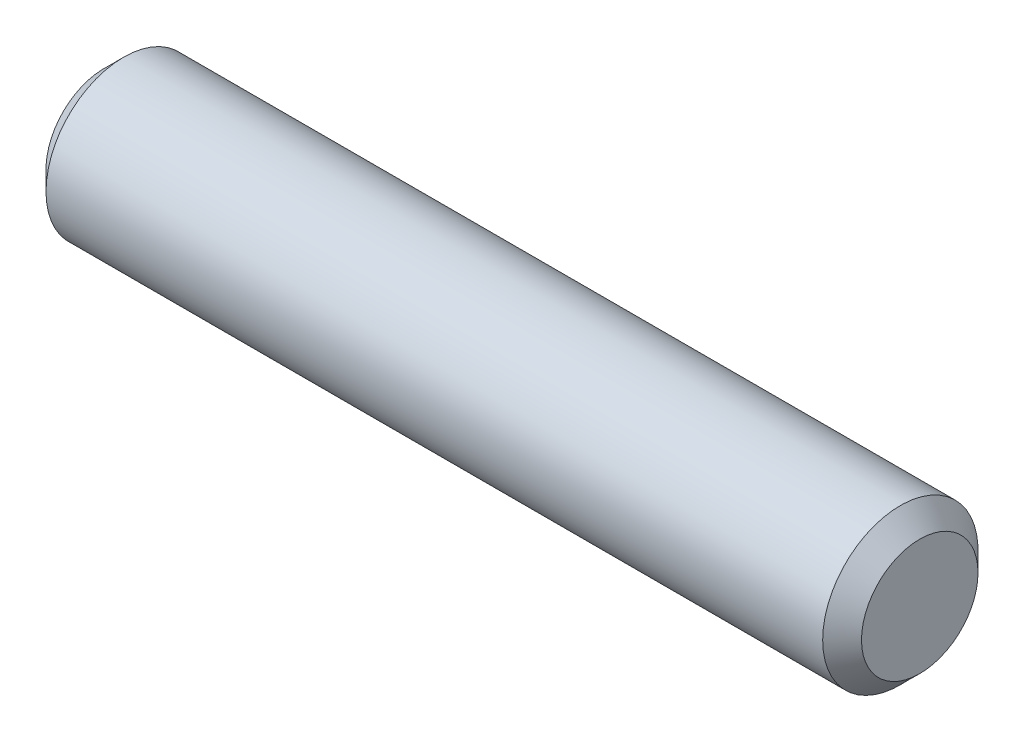
ISO-10303-21;
HEADER;
FILE_DESCRIPTION(('STEP AP214'),'2;1');
FILE_NAME('part.step','',(''),(''),'','','');
FILE_SCHEMA(('AUTOMOTIVE_DESIGN { 1 0 10303 214 1 1 1 1 }'));
ENDSEC;
DATA;
#1=APPLICATION_CONTEXT('core data for automotive mechanical design processes');
#2=APPLICATION_PROTOCOL_DEFINITION('international standard','automotive_design',2000,#1);
#3=PRODUCT_CONTEXT('',#1,'mechanical');
#4=PRODUCT('Part','Part','',(#3));
#5=PRODUCT_RELATED_PRODUCT_CATEGORY('part','',(#4));
#6=PRODUCT_DEFINITION_FORMATION('','',#4);
#7=PRODUCT_DEFINITION_CONTEXT('part definition',#1,'design');
#8=PRODUCT_DEFINITION('design','',#6,#7);
#9=PRODUCT_DEFINITION_SHAPE('','',#8);
#10=(LENGTH_UNIT() NAMED_UNIT(*) SI_UNIT(.MILLI.,.METRE.));
#11=(NAMED_UNIT(*) PLANE_ANGLE_UNIT() SI_UNIT($,.RADIAN.));
#12=(NAMED_UNIT(*) SI_UNIT($,.STERADIAN.) SOLID_ANGLE_UNIT());
#13=UNCERTAINTY_MEASURE_WITH_UNIT(LENGTH_MEASURE(1.E-05),#10,'distance_accuracy_value','');
#14=(GEOMETRIC_REPRESENTATION_CONTEXT(3) GLOBAL_UNCERTAINTY_ASSIGNED_CONTEXT((#13)) GLOBAL_UNIT_ASSIGNED_CONTEXT((#10,
#11,#12)) REPRESENTATION_CONTEXT('',''));
#15=CARTESIAN_POINT('',(0.,0.,0.));
#16=DIRECTION('',(0.,0.,1.));
#17=DIRECTION('',(1.,0.,0.));
#18=AXIS2_PLACEMENT_3D('',#15,#16,#17);
#19=CARTESIAN_POINT('',(10.5,0.,0.));
#20=DIRECTION('',(-1.,0.,0.));
#21=DIRECTION('',(0.,0.,1.));
#22=AXIS2_PLACEMENT_3D('',#19,#20,#21);
#23=CYLINDRICAL_SURFACE('',#22,2.);
#24=CARTESIAN_POINT('',(10.,0.,0.));
#25=DIRECTION('',(1.,0.,0.));
#26=DIRECTION('',(0.,0.,-1.));
#27=AXIS2_PLACEMENT_3D('',#24,#25,#26);
#28=CIRCLE('',#27,2.);
#29=CARTESIAN_POINT('',(10.,0.,2.));
#30=VERTEX_POINT('',#29);
#31=EDGE_CURVE('E54',#30,#30,#28,.F.);
#32=CARTESIAN_POINT('',(-9.99999999999999,0.,0.));
#33=DIRECTION('',(1.,0.,0.));
#34=DIRECTION('',(0.,0.,-1.));
#35=AXIS2_PLACEMENT_3D('',#32,#33,#34);
#36=CIRCLE('',#35,2.);
#37=CARTESIAN_POINT('',(-9.99999999999999,0.,2.));
#38=VERTEX_POINT('',#37);
#39=EDGE_CURVE('E59',#38,#38,#36,.T.);
#40=CARTESIAN_POINT('',(10.,0.,2.));
#41=CARTESIAN_POINT('',(9.79166666666668,0.,2.));
#42=CARTESIAN_POINT('',(9.58333333333334,0.,2.));
#43=CARTESIAN_POINT('',(9.16666666666668,0.,2.));
#44=CARTESIAN_POINT('',(8.95833333333334,0.,2.));
#45=CARTESIAN_POINT('',(8.54166666666668,0.,2.));
#46=CARTESIAN_POINT('',(8.33333333333334,0.,2.));
#47=CARTESIAN_POINT('',(7.91666666666668,0.,2.));
#48=CARTESIAN_POINT('',(7.70833333333334,0.,2.));
#49=CARTESIAN_POINT('',(7.29166666666668,0.,2.));
#50=CARTESIAN_POINT('',(7.08333333333334,0.,2.));
#51=CARTESIAN_POINT('',(6.66666666666668,0.,2.));
#52=CARTESIAN_POINT('',(6.45833333333334,0.,2.));
#53=CARTESIAN_POINT('',(6.04166666666668,0.,2.));
#54=CARTESIAN_POINT('',(5.83333333333334,0.,2.));
#55=CARTESIAN_POINT('',(5.41666666666668,0.,2.));
#56=CARTESIAN_POINT('',(5.20833333333334,0.,2.));
#57=CARTESIAN_POINT('',(4.79166666666668,0.,2.));
#58=CARTESIAN_POINT('',(4.58333333333334,0.,2.));
#59=CARTESIAN_POINT('',(4.16666666666668,0.,2.));
#60=CARTESIAN_POINT('',(3.95833333333334,0.,2.));
#61=CARTESIAN_POINT('',(3.54166666666668,0.,2.));
#62=CARTESIAN_POINT('',(3.33333333333334,0.,2.));
#63=CARTESIAN_POINT('',(2.91666666666668,0.,2.));
#64=CARTESIAN_POINT('',(2.70833333333334,0.,2.));
#65=CARTESIAN_POINT('',(2.29166666666668,0.,2.));
#66=CARTESIAN_POINT('',(2.08333333333334,0.,2.));
#67=CARTESIAN_POINT('',(1.66666666666668,0.,2.));
#68=CARTESIAN_POINT('',(1.45833333333334,0.,2.));
#69=CARTESIAN_POINT('',(1.04166666666668,0.,2.));
#70=CARTESIAN_POINT('',(0.833333333333343,0.,2.));
#71=CARTESIAN_POINT('',(0.416666666666676,0.,2.));
#72=CARTESIAN_POINT('',(0.208333333333342,0.,2.));
#73=CARTESIAN_POINT('',(-0.208333333333325,0.,2.));
#74=CARTESIAN_POINT('',(-0.416666666666658,0.,2.));
#75=CARTESIAN_POINT('',(-0.833333333333325,0.,2.));
#76=CARTESIAN_POINT('',(-1.04166666666666,0.,2.));
#77=CARTESIAN_POINT('',(-1.45833333333333,0.,2.));
#78=CARTESIAN_POINT('',(-1.66666666666666,0.,2.));
#79=CARTESIAN_POINT('',(-2.08333333333332,0.,2.));
#80=CARTESIAN_POINT('',(-2.29166666666666,0.,2.));
#81=CARTESIAN_POINT('',(-2.70833333333333,0.,2.));
#82=CARTESIAN_POINT('',(-2.91666666666666,0.,2.));
#83=CARTESIAN_POINT('',(-3.33333333333333,0.,2.));
#84=CARTESIAN_POINT('',(-3.54166666666666,0.,2.));
#85=CARTESIAN_POINT('',(-3.95833333333333,0.,2.));
#86=CARTESIAN_POINT('',(-4.16666666666666,0.,2.));
#87=CARTESIAN_POINT('',(-4.58333333333333,0.,2.));
#88=CARTESIAN_POINT('',(-4.79166666666666,0.,2.));
#89=CARTESIAN_POINT('',(-5.20833333333333,0.,2.));
#90=CARTESIAN_POINT('',(-5.41666666666666,0.,2.));
#91=CARTESIAN_POINT('',(-5.83333333333333,0.,2.));
#92=CARTESIAN_POINT('',(-6.04166666666666,0.,2.));
#93=CARTESIAN_POINT('',(-6.45833333333333,0.,2.));
#94=CARTESIAN_POINT('',(-6.66666666666666,0.,2.));
#95=CARTESIAN_POINT('',(-7.08333333333332,0.,2.));
#96=CARTESIAN_POINT('',(-7.29166666666666,0.,2.));
#97=CARTESIAN_POINT('',(-7.70833333333333,0.,2.));
#98=CARTESIAN_POINT('',(-7.91666666666666,0.,2.));
#99=CARTESIAN_POINT('',(-8.33333333333333,0.,2.));
#100=CARTESIAN_POINT('',(-8.54166666666666,0.,2.));
#101=CARTESIAN_POINT('',(-8.95833333333333,0.,2.));
#102=CARTESIAN_POINT('',(-9.16666666666666,0.,2.));
#103=CARTESIAN_POINT('',(-9.58333333333333,0.,2.));
#104=CARTESIAN_POINT('',(-9.79166666666666,0.,2.));
#105=CARTESIAN_POINT('',(-9.99999999999999,0.,2.));
#106=B_SPLINE_CURVE_WITH_KNOTS('',3,(#40,#41,#42,#43,#44,#45,#46,#47,#48,#49,#50,#51,#52,#53,
#54,#55,#56,#57,#58,#59,#60,#61,#62,#63,#64,#65,#66,#67,#68,#69,#70,#71,#72,#73,#74,#75,#76,#77,
#78,#79,#80,#81,#82,#83,#84,#85,#86,#87,#88,#89,#90,#91,#92,#93,#94,#95,#96,#97,#98,#99,#100,
#101,#102,#103,#104,#105),.UNSPECIFIED.,.F.,.F.,(4,2,2,2,2,2,2,2,2,2,2,2,2,2,2,2,2,2,2,2,2,2,2,
2,2,2,2,2,2,2,2,2,4),(0.,0.624999999999999,1.25,1.875,2.5,3.125,3.75,4.375,5.,5.625,6.25,6.875,
7.5,8.125,8.75,9.375,10.,10.625,11.25,11.875,12.5,13.125,13.75,14.375,15.,15.625,16.25,16.875,
17.5,18.125,18.75,19.375,20.),.UNSPECIFIED.);
#107=EDGE_CURVE('BSEAM45',#30,#38,#106,.T.);
#108=ORIENTED_EDGE('',*,*,#31,.T.);
#109=ORIENTED_EDGE('',*,*,#39,.T.);
#110=ORIENTED_EDGE('',*,*,#107,.T.);
#111=ORIENTED_EDGE('',*,*,#107,.F.);
#112=EDGE_LOOP('',(#108,#110,#109,#111));
#113=FACE_BOUND('',#112,.T.);
#114=ADVANCED_FACE('F45',(#113),#23,.T.);
#115=CARTESIAN_POINT('',(10.5,0.,0.));
#116=DIRECTION('',(1.,0.,0.));
#117=DIRECTION('',(0.,0.,-1.));
#118=AXIS2_PLACEMENT_3D('',#115,#116,#117);
#119=PLANE('',#118);
#120=CARTESIAN_POINT('',(10.5,0.,0.));
#121=DIRECTION('',(1.,0.,0.));
#122=DIRECTION('',(0.,0.,-1.));
#123=AXIS2_PLACEMENT_3D('',#120,#121,#122);
#124=CIRCLE('',#123,1.50000000000001);
#125=CARTESIAN_POINT('',(10.5,0.,-1.50000000000001));
#126=VERTEX_POINT('',#125);
#127=EDGE_CURVE('E64',#126,#126,#124,.T.);
#128=ORIENTED_EDGE('',*,*,#127,.T.);
#129=EDGE_LOOP('',(#128));
#130=FACE_BOUND('',#129,.T.);
#131=ADVANCED_FACE('F71',(#130),#119,.T.);
#132=CARTESIAN_POINT('',(-10.5,0.,0.));
#133=DIRECTION('',(1.,0.,0.));
#134=DIRECTION('',(0.,0.,-1.));
#135=AXIS2_PLACEMENT_3D('',#132,#133,#134);
#136=PLANE('',#135);
#137=CARTESIAN_POINT('',(-10.5,0.,0.));
#138=DIRECTION('',(1.,0.,0.));
#139=DIRECTION('',(0.,0.,-1.));
#140=AXIS2_PLACEMENT_3D('',#137,#138,#139);
#141=CIRCLE('',#140,1.49999999999999);
#142=CARTESIAN_POINT('',(-10.5,0.,-1.49999999999999));
#143=VERTEX_POINT('',#142);
#144=EDGE_CURVE('E10',#143,#143,#141,.F.);
#145=ORIENTED_EDGE('',*,*,#144,.T.);
#146=EDGE_LOOP('',(#145));
#147=FACE_BOUND('',#146,.T.);
#148=ADVANCED_FACE('F75',(#147),#136,.F.);
#149=CARTESIAN_POINT('',(10.5,0.,0.));
#150=DIRECTION('',(-1.,0.,0.));
#151=DIRECTION('',(0.,0.,1.));
#152=AXIS2_PLACEMENT_3D('',#149,#150,#151);
#153=CONICAL_SURFACE('',#152,1.50000000000001,0.785398163397445);
#154=ORIENTED_EDGE('',*,*,#31,.F.);
#155=EDGE_LOOP('',(#154));
#156=FACE_BOUND('',#155,.T.);
#157=ORIENTED_EDGE('',*,*,#127,.F.);
#158=EDGE_LOOP('',(#157));
#159=FACE_BOUND('',#158,.T.);
#160=ADVANCED_FACE('F73',(#156,#159),#153,.T.);
#161=CARTESIAN_POINT('',(-9.99999999999999,0.,0.));
#162=DIRECTION('',(1.,0.,0.));
#163=DIRECTION('',(0.,0.,-1.));
#164=AXIS2_PLACEMENT_3D('',#161,#162,#163);
#165=CONICAL_SURFACE('',#164,2.,0.78539816339745);
#166=ORIENTED_EDGE('',*,*,#144,.F.);
#167=EDGE_LOOP('',(#166));
#168=FACE_BOUND('',#167,.T.);
#169=ORIENTED_EDGE('',*,*,#39,.F.);
#170=EDGE_LOOP('',(#169));
#171=FACE_BOUND('',#170,.T.);
#172=ADVANCED_FACE('F48',(#168,#171),#165,.T.);
#173=CLOSED_SHELL('',(#114,#131,#148,#160,#172));
#174=MANIFOLD_SOLID_BREP('B2',#173);
#175=ADVANCED_BREP_SHAPE_REPRESENTATION('',(#18,#174),#14);
#176=SHAPE_DEFINITION_REPRESENTATION(#9,#175);
ENDSEC;
END-ISO-10303-21;
